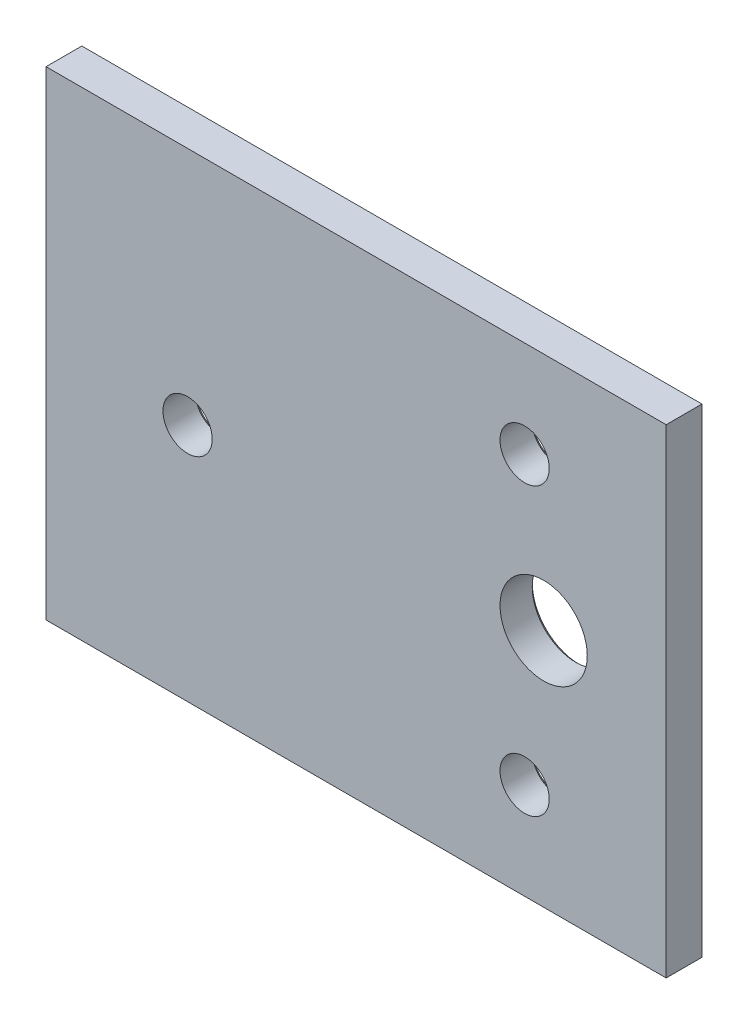
ISO-10303-21;
HEADER;
FILE_DESCRIPTION(('STEP AP214'),'2;1');
FILE_NAME('part.step','',(''),(''),'','','');
FILE_SCHEMA(('AUTOMOTIVE_DESIGN { 1 0 10303 214 1 1 1 1 }'));
ENDSEC;
DATA;
#1=APPLICATION_CONTEXT('core data for automotive mechanical design processes');
#2=APPLICATION_PROTOCOL_DEFINITION('international standard','automotive_design',2000,#1);
#3=PRODUCT_CONTEXT('',#1,'mechanical');
#4=PRODUCT('Part','Part','',(#3));
#5=PRODUCT_RELATED_PRODUCT_CATEGORY('part','',(#4));
#6=PRODUCT_DEFINITION_FORMATION('','',#4);
#7=PRODUCT_DEFINITION_CONTEXT('part definition',#1,'design');
#8=PRODUCT_DEFINITION('design','',#6,#7);
#9=PRODUCT_DEFINITION_SHAPE('','',#8);
#10=(LENGTH_UNIT() NAMED_UNIT(*) SI_UNIT(.MILLI.,.METRE.));
#11=(NAMED_UNIT(*) PLANE_ANGLE_UNIT() SI_UNIT($,.RADIAN.));
#12=(NAMED_UNIT(*) SI_UNIT($,.STERADIAN.) SOLID_ANGLE_UNIT());
#13=UNCERTAINTY_MEASURE_WITH_UNIT(LENGTH_MEASURE(1.E-05),#10,'distance_accuracy_value','');
#14=(GEOMETRIC_REPRESENTATION_CONTEXT(3) GLOBAL_UNCERTAINTY_ASSIGNED_CONTEXT((#13)) GLOBAL_UNIT_ASSIGNED_CONTEXT((#10,
#11,#12)) REPRESENTATION_CONTEXT('',''));
#15=CARTESIAN_POINT('',(0.,0.,0.));
#16=DIRECTION('',(0.,0.,1.));
#17=DIRECTION('',(1.,0.,0.));
#18=AXIS2_PLACEMENT_3D('',#15,#16,#17);
#19=CARTESIAN_POINT('',(0.,0.,-3.175));
#20=DIRECTION('',(0.,0.,1.));
#21=DIRECTION('',(1.,0.,0.));
#22=AXIS2_PLACEMENT_3D('',#19,#20,#21);
#23=PLANE('',#22);
#24=CARTESIAN_POINT('',(33.26638,-3.67414432211888E-11,-3.175));
#25=DIRECTION('',(0.,0.,-1.));
#26=DIRECTION('',(-1.,0.,0.));
#27=AXIS2_PLACEMENT_3D('',#24,#25,#26);
#28=CIRCLE('',#27,8.37438);
#29=CARTESIAN_POINT('',(24.892,-3.67414432211888E-11,-3.175));
#30=VERTEX_POINT('',#29);
#31=EDGE_CURVE('E176',#30,#30,#28,.T.);
#32=ORIENTED_EDGE('',*,*,#31,.F.);
#33=EDGE_LOOP('',(#32));
#34=FACE_BOUND('',#33,.T.);
#35=CARTESIAN_POINT('',(29.8919900000101,25.4000000000367,-3.175));
#36=DIRECTION('',(0.,0.,-1.));
#37=DIRECTION('',(-1.,0.,0.));
#38=AXIS2_PLACEMENT_3D('',#35,#36,#37);
#39=CIRCLE('',#38,4.99999);
#40=CARTESIAN_POINT('',(24.8920000000101,25.4000000000367,-3.175));
#41=VERTEX_POINT('',#40);
#42=EDGE_CURVE('E164',#41,#41,#39,.T.);
#43=ORIENTED_EDGE('',*,*,#42,.F.);
#44=EDGE_LOOP('',(#43));
#45=FACE_BOUND('',#44,.T.);
#46=CARTESIAN_POINT('',(29.8919900000101,-25.3999999999633,-3.175));
#47=DIRECTION('',(0.,0.,-1.));
#48=DIRECTION('',(-1.,0.,0.));
#49=AXIS2_PLACEMENT_3D('',#46,#47,#48);
#50=CIRCLE('',#49,4.99999);
#51=CARTESIAN_POINT('',(24.8920000000101,-25.3999999999633,-3.175));
#52=VERTEX_POINT('',#51);
#53=EDGE_CURVE('E152',#52,#52,#50,.T.);
#54=ORIENTED_EDGE('',*,*,#53,.F.);
#55=EDGE_LOOP('',(#54));
#56=FACE_BOUND('',#55,.T.);
#57=DIRECTION('',(0.,1.,0.));
#58=VECTOR('',#57,1.);
#59=CARTESIAN_POINT('',(55.,42.5,-3.175));
#60=LINE('',#59,#58);
#61=CARTESIAN_POINT('',(55.,-42.5,-3.175));
#62=VERTEX_POINT('',#61);
#63=CARTESIAN_POINT('',(55.,42.5,-3.175));
#64=VERTEX_POINT('',#63);
#65=EDGE_CURVE('E112',#62,#64,#60,.T.);
#66=ORIENTED_EDGE('',*,*,#65,.F.);
#67=DIRECTION('',(1.,0.,0.));
#68=VECTOR('',#67,1.);
#69=CARTESIAN_POINT('',(-55.,-42.5,-3.175));
#70=LINE('',#69,#68);
#71=CARTESIAN_POINT('',(-55.,-42.5,-3.175));
#72=VERTEX_POINT('',#71);
#73=EDGE_CURVE('E84',#72,#62,#70,.T.);
#74=ORIENTED_EDGE('',*,*,#73,.F.);
#75=DIRECTION('',(0.,-1.,0.));
#76=VECTOR('',#75,1.);
#77=CARTESIAN_POINT('',(-55.,42.5,-3.175));
#78=LINE('',#77,#76);
#79=CARTESIAN_POINT('',(-55.,42.5,-3.175));
#80=VERTEX_POINT('',#79);
#81=EDGE_CURVE('E78',#80,#72,#78,.T.);
#82=ORIENTED_EDGE('',*,*,#81,.F.);
#83=DIRECTION('',(-1.,0.,0.));
#84=VECTOR('',#83,1.);
#85=CARTESIAN_POINT('',(-55.,42.5,-3.175));
#86=LINE('',#85,#84);
#87=EDGE_CURVE('E101',#64,#80,#86,.T.);
#88=ORIENTED_EDGE('',*,*,#87,.F.);
#89=EDGE_LOOP('',(#66,#74,#82,#88));
#90=FACE_BOUND('',#89,.T.);
#91=CARTESIAN_POINT('',(-29.89199,3.67483821150927E-11,-3.175));
#92=DIRECTION('',(0.,0.,-1.));
#93=DIRECTION('',(-1.,0.,0.));
#94=AXIS2_PLACEMENT_3D('',#91,#92,#93);
#95=CIRCLE('',#94,4.99999);
#96=CARTESIAN_POINT('',(-34.89198,3.67483821150927E-11,-3.175));
#97=VERTEX_POINT('',#96);
#98=EDGE_CURVE('E140',#97,#97,#95,.T.);
#99=ORIENTED_EDGE('',*,*,#98,.F.);
#100=EDGE_LOOP('',(#99));
#101=FACE_BOUND('',#100,.T.);
#102=ADVANCED_FACE('F43',(#34,#45,#56,#90,#101),#23,.F.);
#103=CARTESIAN_POINT('',(55.,42.5,3.175));
#104=DIRECTION('',(-1.,0.,0.));
#105=DIRECTION('',(0.,-1.,0.));
#106=AXIS2_PLACEMENT_3D('',#103,#104,#105);
#107=PLANE('',#106);
#108=ORIENTED_EDGE('',*,*,#65,.T.);
#109=DIRECTION('',(0.,0.,-1.));
#110=VECTOR('',#109,1.);
#111=CARTESIAN_POINT('',(55.,42.5,3.175));
#112=LINE('',#111,#110);
#113=CARTESIAN_POINT('',(55.,42.5,3.175));
#114=VERTEX_POINT('',#113);
#115=EDGE_CURVE('E11',#114,#64,#112,.T.);
#116=ORIENTED_EDGE('',*,*,#115,.F.);
#117=DIRECTION('',(0.,1.,0.));
#118=VECTOR('',#117,1.);
#119=CARTESIAN_POINT('',(55.,42.5,3.175));
#120=LINE('',#119,#118);
#121=CARTESIAN_POINT('',(55.,-42.5,3.175));
#122=VERTEX_POINT('',#121);
#123=EDGE_CURVE('E96',#122,#114,#120,.T.);
#124=ORIENTED_EDGE('',*,*,#123,.F.);
#125=DIRECTION('',(0.,0.,-1.));
#126=VECTOR('',#125,1.);
#127=CARTESIAN_POINT('',(55.,-42.5,3.175));
#128=LINE('',#127,#126);
#129=EDGE_CURVE('E108',#122,#62,#128,.T.);
#130=ORIENTED_EDGE('',*,*,#129,.T.);
#131=EDGE_LOOP('',(#108,#116,#124,#130));
#132=FACE_BOUND('',#131,.T.);
#133=ADVANCED_FACE('F45',(#132),#107,.F.);
#134=CARTESIAN_POINT('',(-55.,42.5,3.175));
#135=DIRECTION('',(0.,-1.,0.));
#136=DIRECTION('',(0.,0.,-1.));
#137=AXIS2_PLACEMENT_3D('',#134,#135,#136);
#138=PLANE('',#137);
#139=ORIENTED_EDGE('',*,*,#87,.T.);
#140=DIRECTION('',(0.,0.,-1.));
#141=VECTOR('',#140,1.);
#142=CARTESIAN_POINT('',(-55.,42.5,3.175));
#143=LINE('',#142,#141);
#144=CARTESIAN_POINT('',(-55.,42.5,3.175));
#145=VERTEX_POINT('',#144);
#146=EDGE_CURVE('E53',#145,#80,#143,.T.);
#147=ORIENTED_EDGE('',*,*,#146,.F.);
#148=DIRECTION('',(-1.,0.,0.));
#149=VECTOR('',#148,1.);
#150=CARTESIAN_POINT('',(-55.,42.5,3.175));
#151=LINE('',#150,#149);
#152=EDGE_CURVE('E91',#114,#145,#151,.T.);
#153=ORIENTED_EDGE('',*,*,#152,.F.);
#154=ORIENTED_EDGE('',*,*,#115,.T.);
#155=EDGE_LOOP('',(#139,#147,#153,#154));
#156=FACE_BOUND('',#155,.T.);
#157=ADVANCED_FACE('F100',(#156),#138,.F.);
#158=CARTESIAN_POINT('',(-55.,42.5,3.175));
#159=DIRECTION('',(1.,0.,0.));
#160=DIRECTION('',(0.,1.,0.));
#161=AXIS2_PLACEMENT_3D('',#158,#159,#160);
#162=PLANE('',#161);
#163=ORIENTED_EDGE('',*,*,#81,.T.);
#164=DIRECTION('',(0.,0.,-1.));
#165=VECTOR('',#164,1.);
#166=CARTESIAN_POINT('',(-55.,-42.5,3.175));
#167=LINE('',#166,#165);
#168=CARTESIAN_POINT('',(-55.,-42.5,3.175));
#169=VERTEX_POINT('',#168);
#170=EDGE_CURVE('E103',#169,#72,#167,.T.);
#171=ORIENTED_EDGE('',*,*,#170,.F.);
#172=DIRECTION('',(0.,-1.,0.));
#173=VECTOR('',#172,1.);
#174=CARTESIAN_POINT('',(-55.,42.5,3.175));
#175=LINE('',#174,#173);
#176=EDGE_CURVE('E94',#145,#169,#175,.T.);
#177=ORIENTED_EDGE('',*,*,#176,.F.);
#178=ORIENTED_EDGE('',*,*,#146,.T.);
#179=EDGE_LOOP('',(#163,#171,#177,#178));
#180=FACE_BOUND('',#179,.T.);
#181=ADVANCED_FACE('F104',(#180),#162,.F.);
#182=CARTESIAN_POINT('',(-55.,-42.5,3.175));
#183=DIRECTION('',(0.,1.,0.));
#184=DIRECTION('',(0.,0.,1.));
#185=AXIS2_PLACEMENT_3D('',#182,#183,#184);
#186=PLANE('',#185);
#187=ORIENTED_EDGE('',*,*,#73,.T.);
#188=ORIENTED_EDGE('',*,*,#129,.F.);
#189=DIRECTION('',(1.,0.,0.));
#190=VECTOR('',#189,1.);
#191=CARTESIAN_POINT('',(-55.,-42.5,3.175));
#192=LINE('',#191,#190);
#193=EDGE_CURVE('E61',#169,#122,#192,.T.);
#194=ORIENTED_EDGE('',*,*,#193,.F.);
#195=ORIENTED_EDGE('',*,*,#170,.T.);
#196=EDGE_LOOP('',(#187,#188,#194,#195));
#197=FACE_BOUND('',#196,.T.);
#198=ADVANCED_FACE('F126',(#197),#186,.F.);
#199=CARTESIAN_POINT('',(0.,0.,3.175));
#200=DIRECTION('',(0.,0.,1.));
#201=DIRECTION('',(1.,0.,0.));
#202=AXIS2_PLACEMENT_3D('',#199,#200,#201);
#203=PLANE('',#202);
#204=CARTESIAN_POINT('',(33.26638,-3.67414432211888E-11,3.175));
#205=DIRECTION('',(0.,0.,1.));
#206=DIRECTION('',(1.,0.,0.));
#207=AXIS2_PLACEMENT_3D('',#204,#205,#206);
#208=CIRCLE('',#207,7.73938);
#209=CARTESIAN_POINT('',(41.00576,-3.67414432211888E-11,3.175));
#210=VERTEX_POINT('',#209);
#211=EDGE_CURVE('E168',#210,#210,#208,.T.);
#212=ORIENTED_EDGE('',*,*,#211,.F.);
#213=EDGE_LOOP('',(#212));
#214=FACE_BOUND('',#213,.T.);
#215=CARTESIAN_POINT('',(29.8919900000101,25.4000000000367,3.175));
#216=DIRECTION('',(0.,0.,1.));
#217=DIRECTION('',(1.,0.,0.));
#218=AXIS2_PLACEMENT_3D('',#215,#216,#217);
#219=CIRCLE('',#218,4.36499);
#220=CARTESIAN_POINT('',(34.2569800000101,25.4000000000367,3.175));
#221=VERTEX_POINT('',#220);
#222=EDGE_CURVE('E156',#221,#221,#219,.T.);
#223=ORIENTED_EDGE('',*,*,#222,.F.);
#224=EDGE_LOOP('',(#223));
#225=FACE_BOUND('',#224,.T.);
#226=CARTESIAN_POINT('',(29.8919900000101,-25.3999999999633,3.175));
#227=DIRECTION('',(0.,0.,1.));
#228=DIRECTION('',(1.,0.,0.));
#229=AXIS2_PLACEMENT_3D('',#226,#227,#228);
#230=CIRCLE('',#229,4.36499);
#231=CARTESIAN_POINT('',(34.2569800000101,-25.3999999999633,3.175));
#232=VERTEX_POINT('',#231);
#233=EDGE_CURVE('E144',#232,#232,#230,.T.);
#234=ORIENTED_EDGE('',*,*,#233,.F.);
#235=EDGE_LOOP('',(#234));
#236=FACE_BOUND('',#235,.T.);
#237=CARTESIAN_POINT('',(-29.89199,3.67483821150927E-11,3.175));
#238=DIRECTION('',(0.,0.,1.));
#239=DIRECTION('',(1.,0.,0.));
#240=AXIS2_PLACEMENT_3D('',#237,#238,#239);
#241=CIRCLE('',#240,4.36499);
#242=CARTESIAN_POINT('',(-25.527,3.67483821150927E-11,3.175));
#243=VERTEX_POINT('',#242);
#244=EDGE_CURVE('E116',#243,#243,#241,.T.);
#245=ORIENTED_EDGE('',*,*,#244,.F.);
#246=EDGE_LOOP('',(#245));
#247=FACE_BOUND('',#246,.T.);
#248=ORIENTED_EDGE('',*,*,#123,.T.);
#249=ORIENTED_EDGE('',*,*,#152,.T.);
#250=ORIENTED_EDGE('',*,*,#176,.T.);
#251=ORIENTED_EDGE('',*,*,#193,.T.);
#252=EDGE_LOOP('',(#248,#249,#250,#251));
#253=FACE_BOUND('',#252,.T.);
#254=ADVANCED_FACE('F92',(#214,#225,#236,#247,#253),#203,.T.);
#255=CARTESIAN_POINT('',(-29.89199,3.67483821150927E-11,-3.175));
#256=DIRECTION('',(0.,0.,-1.));
#257=DIRECTION('',(-1.,0.,0.));
#258=AXIS2_PLACEMENT_3D('',#255,#256,#257);
#259=CYLINDRICAL_SURFACE('',#258,4.36499);
#260=CARTESIAN_POINT('',(-29.89199,3.67483821150927E-11,-2.54));
#261=DIRECTION('',(0.,0.,-1.));
#262=DIRECTION('',(-1.,0.,0.));
#263=AXIS2_PLACEMENT_3D('',#260,#261,#262);
#264=CIRCLE('',#263,4.36499);
#265=CARTESIAN_POINT('',(-34.25698,3.67483821150927E-11,-2.54));
#266=VERTEX_POINT('',#265);
#267=EDGE_CURVE('E136',#266,#266,#264,.T.);
#268=ORIENTED_EDGE('',*,*,#267,.T.);
#269=EDGE_LOOP('',(#268));
#270=FACE_BOUND('',#269,.T.);
#271=ORIENTED_EDGE('',*,*,#244,.T.);
#272=EDGE_LOOP('',(#271));
#273=FACE_BOUND('',#272,.T.);
#274=ADVANCED_FACE('F211',(#270,#273),#259,.F.);
#275=CARTESIAN_POINT('',(-29.89199,3.67483821150927E-11,-3.175));
#276=DIRECTION('',(0.,0.,-1.));
#277=DIRECTION('',(-1.,0.,0.));
#278=AXIS2_PLACEMENT_3D('',#275,#276,#277);
#279=CONICAL_SURFACE('',#278,4.99999,0.78539816339745);
#280=ORIENTED_EDGE('',*,*,#267,.F.);
#281=EDGE_LOOP('',(#280));
#282=FACE_BOUND('',#281,.T.);
#283=ORIENTED_EDGE('',*,*,#98,.T.);
#284=EDGE_LOOP('',(#283));
#285=FACE_BOUND('',#284,.T.);
#286=ADVANCED_FACE('F203',(#282,#285),#279,.F.);
#287=CARTESIAN_POINT('',(29.8919900000101,-25.3999999999633,-3.175));
#288=DIRECTION('',(0.,0.,-1.));
#289=DIRECTION('',(-1.,0.,0.));
#290=AXIS2_PLACEMENT_3D('',#287,#288,#289);
#291=CYLINDRICAL_SURFACE('',#290,4.36499);
#292=CARTESIAN_POINT('',(29.8919900000101,-25.3999999999633,-2.54));
#293=DIRECTION('',(0.,0.,-1.));
#294=DIRECTION('',(-1.,0.,0.));
#295=AXIS2_PLACEMENT_3D('',#292,#293,#294);
#296=CIRCLE('',#295,4.36499);
#297=CARTESIAN_POINT('',(25.5270000000101,-25.3999999999633,-2.54));
#298=VERTEX_POINT('',#297);
#299=EDGE_CURVE('E148',#298,#298,#296,.T.);
#300=ORIENTED_EDGE('',*,*,#299,.T.);
#301=EDGE_LOOP('',(#300));
#302=FACE_BOUND('',#301,.T.);
#303=ORIENTED_EDGE('',*,*,#233,.T.);
#304=EDGE_LOOP('',(#303));
#305=FACE_BOUND('',#304,.T.);
#306=ADVANCED_FACE('F193',(#302,#305),#291,.F.);
#307=CARTESIAN_POINT('',(29.8919900000101,-25.3999999999633,-3.175));
#308=DIRECTION('',(0.,0.,-1.));
#309=DIRECTION('',(-1.,0.,0.));
#310=AXIS2_PLACEMENT_3D('',#307,#308,#309);
#311=CONICAL_SURFACE('',#310,4.99999,0.785398163397447);
#312=ORIENTED_EDGE('',*,*,#299,.F.);
#313=EDGE_LOOP('',(#312));
#314=FACE_BOUND('',#313,.T.);
#315=ORIENTED_EDGE('',*,*,#53,.T.);
#316=EDGE_LOOP('',(#315));
#317=FACE_BOUND('',#316,.T.);
#318=ADVANCED_FACE('F190',(#314,#317),#311,.F.);
#319=CARTESIAN_POINT('',(29.8919900000101,25.4000000000367,-3.175));
#320=DIRECTION('',(0.,0.,-1.));
#321=DIRECTION('',(-1.,0.,0.));
#322=AXIS2_PLACEMENT_3D('',#319,#320,#321);
#323=CYLINDRICAL_SURFACE('',#322,4.36499);
#324=CARTESIAN_POINT('',(29.8919900000101,25.4000000000367,-2.54));
#325=DIRECTION('',(0.,0.,-1.));
#326=DIRECTION('',(-1.,0.,0.));
#327=AXIS2_PLACEMENT_3D('',#324,#325,#326);
#328=CIRCLE('',#327,4.36499);
#329=CARTESIAN_POINT('',(25.5270000000101,25.4000000000367,-2.54));
#330=VERTEX_POINT('',#329);
#331=EDGE_CURVE('E160',#330,#330,#328,.T.);
#332=ORIENTED_EDGE('',*,*,#331,.T.);
#333=EDGE_LOOP('',(#332));
#334=FACE_BOUND('',#333,.T.);
#335=ORIENTED_EDGE('',*,*,#222,.T.);
#336=EDGE_LOOP('',(#335));
#337=FACE_BOUND('',#336,.T.);
#338=ADVANCED_FACE('F192',(#334,#337),#323,.F.);
#339=CARTESIAN_POINT('',(29.8919900000101,25.4000000000367,-3.175));
#340=DIRECTION('',(0.,0.,-1.));
#341=DIRECTION('',(-1.,0.,0.));
#342=AXIS2_PLACEMENT_3D('',#339,#340,#341);
#343=CONICAL_SURFACE('',#342,4.99999,0.785398163397447);
#344=ORIENTED_EDGE('',*,*,#331,.F.);
#345=EDGE_LOOP('',(#344));
#346=FACE_BOUND('',#345,.T.);
#347=ORIENTED_EDGE('',*,*,#42,.T.);
#348=EDGE_LOOP('',(#347));
#349=FACE_BOUND('',#348,.T.);
#350=ADVANCED_FACE('F200',(#346,#349),#343,.F.);
#351=CARTESIAN_POINT('',(33.26638,-3.67414432211888E-11,-3.175));
#352=DIRECTION('',(0.,0.,-1.));
#353=DIRECTION('',(-1.,0.,0.));
#354=AXIS2_PLACEMENT_3D('',#351,#352,#353);
#355=CYLINDRICAL_SURFACE('',#354,7.73938);
#356=CARTESIAN_POINT('',(33.26638,-3.67414432211888E-11,-2.54));
#357=DIRECTION('',(0.,0.,-1.));
#358=DIRECTION('',(-1.,0.,0.));
#359=AXIS2_PLACEMENT_3D('',#356,#357,#358);
#360=CIRCLE('',#359,7.73938);
#361=CARTESIAN_POINT('',(25.527,-3.67414432211888E-11,-2.54));
#362=VERTEX_POINT('',#361);
#363=EDGE_CURVE('E172',#362,#362,#360,.T.);
#364=ORIENTED_EDGE('',*,*,#363,.T.);
#365=EDGE_LOOP('',(#364));
#366=FACE_BOUND('',#365,.T.);
#367=ORIENTED_EDGE('',*,*,#211,.T.);
#368=EDGE_LOOP('',(#367));
#369=FACE_BOUND('',#368,.T.);
#370=ADVANCED_FACE('F251',(#366,#369),#355,.F.);
#371=CARTESIAN_POINT('',(33.26638,-3.67414432211888E-11,-3.175));
#372=DIRECTION('',(0.,0.,-1.));
#373=DIRECTION('',(-1.,0.,0.));
#374=AXIS2_PLACEMENT_3D('',#371,#372,#373);
#375=CONICAL_SURFACE('',#374,8.37438,0.78539816339745);
#376=ORIENTED_EDGE('',*,*,#363,.F.);
#377=EDGE_LOOP('',(#376));
#378=FACE_BOUND('',#377,.T.);
#379=ORIENTED_EDGE('',*,*,#31,.T.);
#380=EDGE_LOOP('',(#379));
#381=FACE_BOUND('',#380,.T.);
#382=ADVANCED_FACE('F181',(#378,#381),#375,.F.);
#383=CLOSED_SHELL('',(#102,#133,#157,#181,#198,#254,#274,#286,#306,#318,#338,#350,#370,#382));
#384=MANIFOLD_SOLID_BREP('B2',#383);
#385=ADVANCED_BREP_SHAPE_REPRESENTATION('',(#18,#384),#14);
#386=SHAPE_DEFINITION_REPRESENTATION(#9,#385);
ENDSEC;
END-ISO-10303-21;
